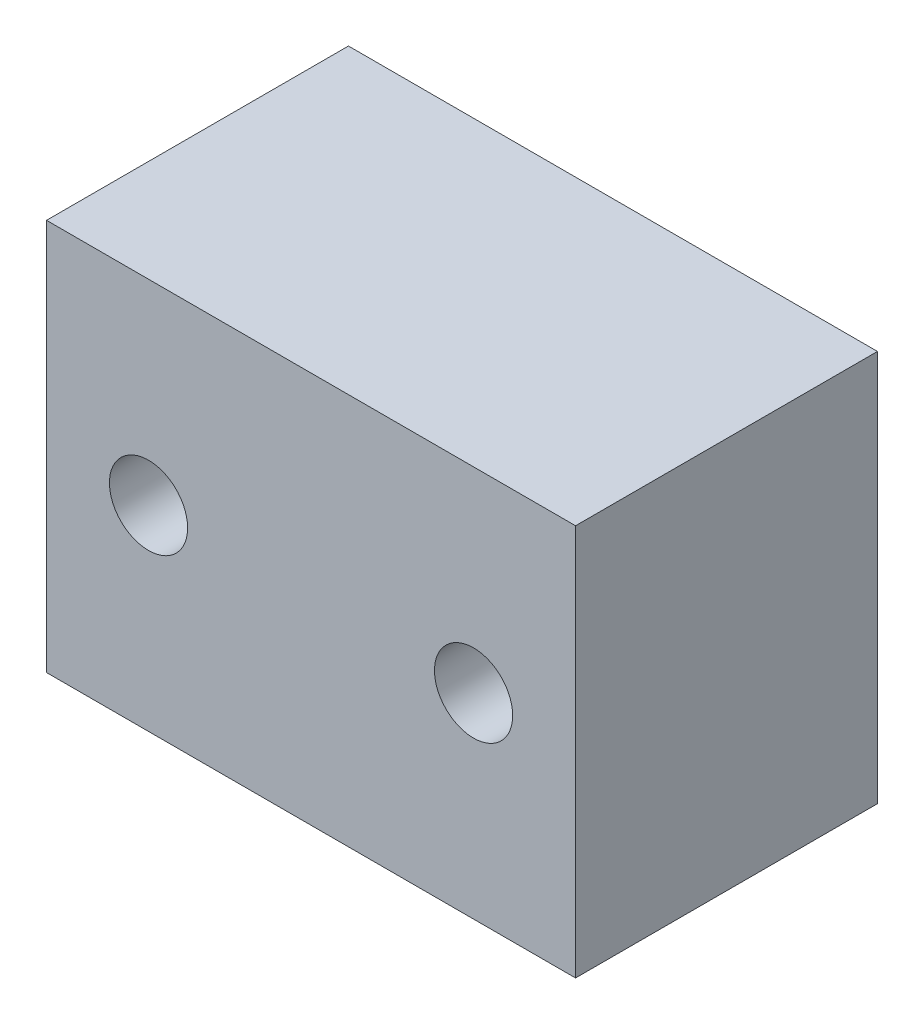
ISO-10303-21;
HEADER;
FILE_DESCRIPTION(('STEP AP214'),'2;1');
FILE_NAME('part.step','',(''),(''),'','','');
FILE_SCHEMA(('AUTOMOTIVE_DESIGN { 1 0 10303 214 1 1 1 1 }'));
ENDSEC;
DATA;
#1=APPLICATION_CONTEXT('core data for automotive mechanical design processes');
#2=APPLICATION_PROTOCOL_DEFINITION('international standard','automotive_design',2000,#1);
#3=PRODUCT_CONTEXT('',#1,'mechanical');
#4=PRODUCT('Part','Part','',(#3));
#5=PRODUCT_RELATED_PRODUCT_CATEGORY('part','',(#4));
#6=PRODUCT_DEFINITION_FORMATION('','',#4);
#7=PRODUCT_DEFINITION_CONTEXT('part definition',#1,'design');
#8=PRODUCT_DEFINITION('design','',#6,#7);
#9=PRODUCT_DEFINITION_SHAPE('','',#8);
#10=(LENGTH_UNIT() NAMED_UNIT(*) SI_UNIT(.MILLI.,.METRE.));
#11=(NAMED_UNIT(*) PLANE_ANGLE_UNIT() SI_UNIT($,.RADIAN.));
#12=(NAMED_UNIT(*) SI_UNIT($,.STERADIAN.) SOLID_ANGLE_UNIT());
#13=UNCERTAINTY_MEASURE_WITH_UNIT(LENGTH_MEASURE(1.E-05),#10,'distance_accuracy_value','');
#14=(GEOMETRIC_REPRESENTATION_CONTEXT(3) GLOBAL_UNCERTAINTY_ASSIGNED_CONTEXT((#13)) GLOBAL_UNIT_ASSIGNED_CONTEXT((#10,
#11,#12)) REPRESENTATION_CONTEXT('',''));
#15=CARTESIAN_POINT('',(0.,0.,0.));
#16=DIRECTION('',(0.,0.,1.));
#17=DIRECTION('',(1.,0.,0.));
#18=AXIS2_PLACEMENT_3D('',#15,#16,#17);
#19=CARTESIAN_POINT('',(-77.8,-57.6,88.8));
#20=DIRECTION('',(1.,0.,0.));
#21=DIRECTION('',(0.,0.,-1.));
#22=AXIS2_PLACEMENT_3D('',#19,#20,#21);
#23=PLANE('',#22);
#24=DIRECTION('',(0.,-1.,0.));
#25=VECTOR('',#24,1.);
#26=CARTESIAN_POINT('',(-77.8,-57.6,0.));
#27=LINE('',#26,#25);
#28=CARTESIAN_POINT('',(-77.8,57.6,0.));
#29=VERTEX_POINT('',#28);
#30=CARTESIAN_POINT('',(-77.8,-57.6,0.));
#31=VERTEX_POINT('',#30);
#32=EDGE_CURVE('E96',#29,#31,#27,.T.);
#33=ORIENTED_EDGE('',*,*,#32,.T.);
#34=DIRECTION('',(0.,0.,-1.));
#35=VECTOR('',#34,1.);
#36=CARTESIAN_POINT('',(-77.8,-57.6,88.8));
#37=LINE('',#36,#35);
#38=CARTESIAN_POINT('',(-77.8,-57.6,88.8));
#39=VERTEX_POINT('',#38);
#40=EDGE_CURVE('E11',#39,#31,#37,.T.);
#41=ORIENTED_EDGE('',*,*,#40,.F.);
#42=DIRECTION('',(0.,-1.,0.));
#43=VECTOR('',#42,1.);
#44=CARTESIAN_POINT('',(-77.8,-57.6,88.8));
#45=LINE('',#44,#43);
#46=CARTESIAN_POINT('',(-77.8,57.6,88.8));
#47=VERTEX_POINT('',#46);
#48=EDGE_CURVE('E84',#47,#39,#45,.T.);
#49=ORIENTED_EDGE('',*,*,#48,.F.);
#50=DIRECTION('',(0.,0.,-1.));
#51=VECTOR('',#50,1.);
#52=CARTESIAN_POINT('',(-77.8,57.6,88.8));
#53=LINE('',#52,#51);
#54=EDGE_CURVE('E92',#47,#29,#53,.T.);
#55=ORIENTED_EDGE('',*,*,#54,.T.);
#56=EDGE_LOOP('',(#33,#41,#49,#55));
#57=FACE_BOUND('',#56,.T.);
#58=ADVANCED_FACE('F33',(#57),#23,.F.);
#59=CARTESIAN_POINT('',(77.8,-57.6,88.8));
#60=DIRECTION('',(0.,1.,0.));
#61=DIRECTION('',(-1.,0.,0.));
#62=AXIS2_PLACEMENT_3D('',#59,#60,#61);
#63=PLANE('',#62);
#64=DIRECTION('',(1.,0.,0.));
#65=VECTOR('',#64,1.);
#66=CARTESIAN_POINT('',(77.8,-57.6,0.));
#67=LINE('',#66,#65);
#68=CARTESIAN_POINT('',(77.8,-57.6,0.));
#69=VERTEX_POINT('',#68);
#70=EDGE_CURVE('E88',#31,#69,#67,.T.);
#71=ORIENTED_EDGE('',*,*,#70,.T.);
#72=DIRECTION('',(0.,0.,-1.));
#73=VECTOR('',#72,1.);
#74=CARTESIAN_POINT('',(77.8,-57.6,88.8));
#75=LINE('',#74,#73);
#76=CARTESIAN_POINT('',(77.8,-57.6,88.8));
#77=VERTEX_POINT('',#76);
#78=EDGE_CURVE('E41',#77,#69,#75,.T.);
#79=ORIENTED_EDGE('',*,*,#78,.F.);
#80=DIRECTION('',(1.,0.,0.));
#81=VECTOR('',#80,1.);
#82=CARTESIAN_POINT('',(77.8,-57.6,88.8));
#83=LINE('',#82,#81);
#84=EDGE_CURVE('E79',#39,#77,#83,.T.);
#85=ORIENTED_EDGE('',*,*,#84,.F.);
#86=ORIENTED_EDGE('',*,*,#40,.T.);
#87=EDGE_LOOP('',(#71,#79,#85,#86));
#88=FACE_BOUND('',#87,.T.);
#89=ADVANCED_FACE('F87',(#88),#63,.F.);
#90=CARTESIAN_POINT('',(77.8,-57.6,88.8));
#91=DIRECTION('',(-1.,0.,0.));
#92=DIRECTION('',(0.,0.,1.));
#93=AXIS2_PLACEMENT_3D('',#90,#91,#92);
#94=PLANE('',#93);
#95=DIRECTION('',(0.,1.,0.));
#96=VECTOR('',#95,1.);
#97=CARTESIAN_POINT('',(77.8,-57.6,0.));
#98=LINE('',#97,#96);
#99=CARTESIAN_POINT('',(77.8,57.6,0.));
#100=VERTEX_POINT('',#99);
#101=EDGE_CURVE('E66',#69,#100,#98,.T.);
#102=ORIENTED_EDGE('',*,*,#101,.T.);
#103=DIRECTION('',(0.,0.,-1.));
#104=VECTOR('',#103,1.);
#105=CARTESIAN_POINT('',(77.8,57.6,88.8));
#106=LINE('',#105,#104);
#107=CARTESIAN_POINT('',(77.8,57.6,88.8));
#108=VERTEX_POINT('',#107);
#109=EDGE_CURVE('E89',#108,#100,#106,.T.);
#110=ORIENTED_EDGE('',*,*,#109,.F.);
#111=DIRECTION('',(0.,1.,0.));
#112=VECTOR('',#111,1.);
#113=CARTESIAN_POINT('',(77.8,-57.6,88.8));
#114=LINE('',#113,#112);
#115=EDGE_CURVE('E82',#77,#108,#114,.T.);
#116=ORIENTED_EDGE('',*,*,#115,.F.);
#117=ORIENTED_EDGE('',*,*,#78,.T.);
#118=EDGE_LOOP('',(#102,#110,#116,#117));
#119=FACE_BOUND('',#118,.T.);
#120=ADVANCED_FACE('F90',(#119),#94,.F.);
#121=CARTESIAN_POINT('',(77.8,57.6,88.8));
#122=DIRECTION('',(0.,-1.,0.));
#123=DIRECTION('',(0.,0.,-1.));
#124=AXIS2_PLACEMENT_3D('',#121,#122,#123);
#125=PLANE('',#124);
#126=DIRECTION('',(-1.,0.,0.));
#127=VECTOR('',#126,1.);
#128=CARTESIAN_POINT('',(77.8,57.6,0.));
#129=LINE('',#128,#127);
#130=EDGE_CURVE('E72',#100,#29,#129,.T.);
#131=ORIENTED_EDGE('',*,*,#130,.T.);
#132=ORIENTED_EDGE('',*,*,#54,.F.);
#133=DIRECTION('',(-1.,0.,0.));
#134=VECTOR('',#133,1.);
#135=CARTESIAN_POINT('',(77.8,57.6,88.8));
#136=LINE('',#135,#134);
#137=EDGE_CURVE('E49',#108,#47,#136,.T.);
#138=ORIENTED_EDGE('',*,*,#137,.F.);
#139=ORIENTED_EDGE('',*,*,#109,.T.);
#140=EDGE_LOOP('',(#131,#132,#138,#139));
#141=FACE_BOUND('',#140,.T.);
#142=ADVANCED_FACE('F104',(#141),#125,.F.);
#143=CARTESIAN_POINT('',(0.,0.,88.8));
#144=DIRECTION('',(0.,0.,1.));
#145=DIRECTION('',(1.,0.,0.));
#146=AXIS2_PLACEMENT_3D('',#143,#144,#145);
#147=PLANE('',#146);
#148=CARTESIAN_POINT('',(47.8,0.,88.8));
#149=DIRECTION('',(0.,0.,1.));
#150=DIRECTION('',(1.,0.,0.));
#151=AXIS2_PLACEMENT_3D('',#148,#149,#150);
#152=CIRCLE('',#151,11.5);
#153=CARTESIAN_POINT('',(59.3,0.,88.8));
#154=VERTEX_POINT('',#153);
#155=EDGE_CURVE('E130',#154,#154,#152,.T.);
#156=ORIENTED_EDGE('',*,*,#155,.F.);
#157=EDGE_LOOP('',(#156));
#158=FACE_BOUND('',#157,.T.);
#159=CARTESIAN_POINT('',(-47.8,0.,88.8));
#160=DIRECTION('',(0.,0.,1.));
#161=DIRECTION('',(1.,0.,0.));
#162=AXIS2_PLACEMENT_3D('',#159,#160,#161);
#163=CIRCLE('',#162,11.5);
#164=CARTESIAN_POINT('',(-36.3,0.,88.8));
#165=VERTEX_POINT('',#164);
#166=EDGE_CURVE('E118',#165,#165,#163,.T.);
#167=ORIENTED_EDGE('',*,*,#166,.F.);
#168=EDGE_LOOP('',(#167));
#169=FACE_BOUND('',#168,.T.);
#170=ORIENTED_EDGE('',*,*,#48,.T.);
#171=ORIENTED_EDGE('',*,*,#84,.T.);
#172=ORIENTED_EDGE('',*,*,#115,.T.);
#173=ORIENTED_EDGE('',*,*,#137,.T.);
#174=EDGE_LOOP('',(#170,#171,#172,#173));
#175=FACE_BOUND('',#174,.T.);
#176=ADVANCED_FACE('F80',(#158,#169,#175),#147,.T.);
#177=CARTESIAN_POINT('',(0.,0.,0.));
#178=DIRECTION('',(0.,0.,1.));
#179=DIRECTION('',(1.,0.,0.));
#180=AXIS2_PLACEMENT_3D('',#177,#178,#179);
#181=PLANE('',#180);
#182=CARTESIAN_POINT('',(47.8,0.,0.));
#183=DIRECTION('',(0.,0.,1.));
#184=DIRECTION('',(1.,0.,0.));
#185=AXIS2_PLACEMENT_3D('',#182,#183,#184);
#186=CIRCLE('',#185,4.49999999999998);
#187=CARTESIAN_POINT('',(52.3,0.,0.));
#188=VERTEX_POINT('',#187);
#189=EDGE_CURVE('E121',#188,#188,#186,.T.);
#190=ORIENTED_EDGE('',*,*,#189,.T.);
#191=EDGE_LOOP('',(#190));
#192=FACE_BOUND('',#191,.T.);
#193=CARTESIAN_POINT('',(-47.8,0.,0.));
#194=DIRECTION('',(0.,0.,1.));
#195=DIRECTION('',(1.,0.,0.));
#196=AXIS2_PLACEMENT_3D('',#193,#194,#195);
#197=CIRCLE('',#196,4.49999999999998);
#198=CARTESIAN_POINT('',(-43.3,0.,0.));
#199=VERTEX_POINT('',#198);
#200=EDGE_CURVE('E99',#199,#199,#197,.T.);
#201=ORIENTED_EDGE('',*,*,#200,.T.);
#202=EDGE_LOOP('',(#201));
#203=FACE_BOUND('',#202,.T.);
#204=ORIENTED_EDGE('',*,*,#32,.F.);
#205=ORIENTED_EDGE('',*,*,#130,.F.);
#206=ORIENTED_EDGE('',*,*,#101,.F.);
#207=ORIENTED_EDGE('',*,*,#70,.F.);
#208=EDGE_LOOP('',(#204,#205,#206,#207));
#209=FACE_BOUND('',#208,.T.);
#210=ADVANCED_FACE('F107',(#192,#203,#209),#181,.F.);
#211=CARTESIAN_POINT('',(-47.8,0.,88.8));
#212=DIRECTION('',(0.,0.,1.));
#213=DIRECTION('',(1.,0.,0.));
#214=AXIS2_PLACEMENT_3D('',#211,#212,#213);
#215=CYLINDRICAL_SURFACE('',#214,4.49999999999998);
#216=ORIENTED_EDGE('',*,*,#200,.F.);
#217=EDGE_LOOP('',(#216));
#218=FACE_BOUND('',#217,.T.);
#219=CARTESIAN_POINT('',(-47.8,0.,8.8));
#220=DIRECTION('',(0.,0.,1.));
#221=DIRECTION('',(1.,0.,0.));
#222=AXIS2_PLACEMENT_3D('',#219,#220,#221);
#223=CIRCLE('',#222,4.49999999999998);
#224=CARTESIAN_POINT('',(-43.3,0.,8.8));
#225=VERTEX_POINT('',#224);
#226=EDGE_CURVE('E112',#225,#225,#223,.T.);
#227=ORIENTED_EDGE('',*,*,#226,.T.);
#228=EDGE_LOOP('',(#227));
#229=FACE_BOUND('',#228,.T.);
#230=ADVANCED_FACE('F154',(#218,#229),#215,.F.);
#231=CARTESIAN_POINT('',(-43.3,0.,8.8));
#232=DIRECTION('',(0.,0.,-1.));
#233=DIRECTION('',(-1.,0.,0.));
#234=AXIS2_PLACEMENT_3D('',#231,#232,#233);
#235=PLANE('',#234);
#236=ORIENTED_EDGE('',*,*,#226,.F.);
#237=EDGE_LOOP('',(#236));
#238=FACE_BOUND('',#237,.T.);
#239=CARTESIAN_POINT('',(-47.8,0.,8.8));
#240=DIRECTION('',(0.,0.,1.));
#241=DIRECTION('',(1.,0.,0.));
#242=AXIS2_PLACEMENT_3D('',#239,#240,#241);
#243=CIRCLE('',#242,11.5);
#244=CARTESIAN_POINT('',(-36.3,0.,8.8));
#245=VERTEX_POINT('',#244);
#246=EDGE_CURVE('E115',#245,#245,#243,.T.);
#247=ORIENTED_EDGE('',*,*,#246,.T.);
#248=EDGE_LOOP('',(#247));
#249=FACE_BOUND('',#248,.T.);
#250=ADVANCED_FACE('F144',(#238,#249),#235,.F.);
#251=CARTESIAN_POINT('',(-47.8,0.,88.8));
#252=DIRECTION('',(0.,0.,1.));
#253=DIRECTION('',(1.,0.,0.));
#254=AXIS2_PLACEMENT_3D('',#251,#252,#253);
#255=CYLINDRICAL_SURFACE('',#254,11.5);
#256=ORIENTED_EDGE('',*,*,#246,.F.);
#257=EDGE_LOOP('',(#256));
#258=FACE_BOUND('',#257,.T.);
#259=ORIENTED_EDGE('',*,*,#166,.T.);
#260=EDGE_LOOP('',(#259));
#261=FACE_BOUND('',#260,.T.);
#262=ADVANCED_FACE('F141',(#258,#261),#255,.F.);
#263=CARTESIAN_POINT('',(47.8,0.,88.8));
#264=DIRECTION('',(0.,0.,1.));
#265=DIRECTION('',(1.,0.,0.));
#266=AXIS2_PLACEMENT_3D('',#263,#264,#265);
#267=CYLINDRICAL_SURFACE('',#266,4.49999999999998);
#268=ORIENTED_EDGE('',*,*,#189,.F.);
#269=EDGE_LOOP('',(#268));
#270=FACE_BOUND('',#269,.T.);
#271=CARTESIAN_POINT('',(47.8,0.,8.8));
#272=DIRECTION('',(0.,0.,1.));
#273=DIRECTION('',(1.,0.,0.));
#274=AXIS2_PLACEMENT_3D('',#271,#272,#273);
#275=CIRCLE('',#274,4.49999999999998);
#276=CARTESIAN_POINT('',(52.3,0.,8.8));
#277=VERTEX_POINT('',#276);
#278=EDGE_CURVE('E124',#277,#277,#275,.T.);
#279=ORIENTED_EDGE('',*,*,#278,.T.);
#280=EDGE_LOOP('',(#279));
#281=FACE_BOUND('',#280,.T.);
#282=ADVANCED_FACE('F143',(#270,#281),#267,.F.);
#283=CARTESIAN_POINT('',(52.3,0.,8.8));
#284=DIRECTION('',(0.,0.,-1.));
#285=DIRECTION('',(-1.,0.,0.));
#286=AXIS2_PLACEMENT_3D('',#283,#284,#285);
#287=PLANE('',#286);
#288=ORIENTED_EDGE('',*,*,#278,.F.);
#289=EDGE_LOOP('',(#288));
#290=FACE_BOUND('',#289,.T.);
#291=CARTESIAN_POINT('',(47.8,0.,8.8));
#292=DIRECTION('',(0.,0.,1.));
#293=DIRECTION('',(1.,0.,0.));
#294=AXIS2_PLACEMENT_3D('',#291,#292,#293);
#295=CIRCLE('',#294,11.5);
#296=CARTESIAN_POINT('',(59.3,0.,8.8));
#297=VERTEX_POINT('',#296);
#298=EDGE_CURVE('E127',#297,#297,#295,.T.);
#299=ORIENTED_EDGE('',*,*,#298,.T.);
#300=EDGE_LOOP('',(#299));
#301=FACE_BOUND('',#300,.T.);
#302=ADVANCED_FACE('F151',(#290,#301),#287,.F.);
#303=CARTESIAN_POINT('',(47.8,0.,88.8));
#304=DIRECTION('',(0.,0.,1.));
#305=DIRECTION('',(1.,0.,0.));
#306=AXIS2_PLACEMENT_3D('',#303,#304,#305);
#307=CYLINDRICAL_SURFACE('',#306,11.5);
#308=ORIENTED_EDGE('',*,*,#298,.F.);
#309=EDGE_LOOP('',(#308));
#310=FACE_BOUND('',#309,.T.);
#311=ORIENTED_EDGE('',*,*,#155,.T.);
#312=EDGE_LOOP('',(#311));
#313=FACE_BOUND('',#312,.T.);
#314=ADVANCED_FACE('F134',(#310,#313),#307,.F.);
#315=CLOSED_SHELL('',(#58,#89,#120,#142,#176,#210,#230,#250,#262,#282,#302,#314));
#316=MANIFOLD_SOLID_BREP('B2',#315);
#317=ADVANCED_BREP_SHAPE_REPRESENTATION('',(#18,#316),#14);
#318=SHAPE_DEFINITION_REPRESENTATION(#9,#317);
ENDSEC;
END-ISO-10303-21;
